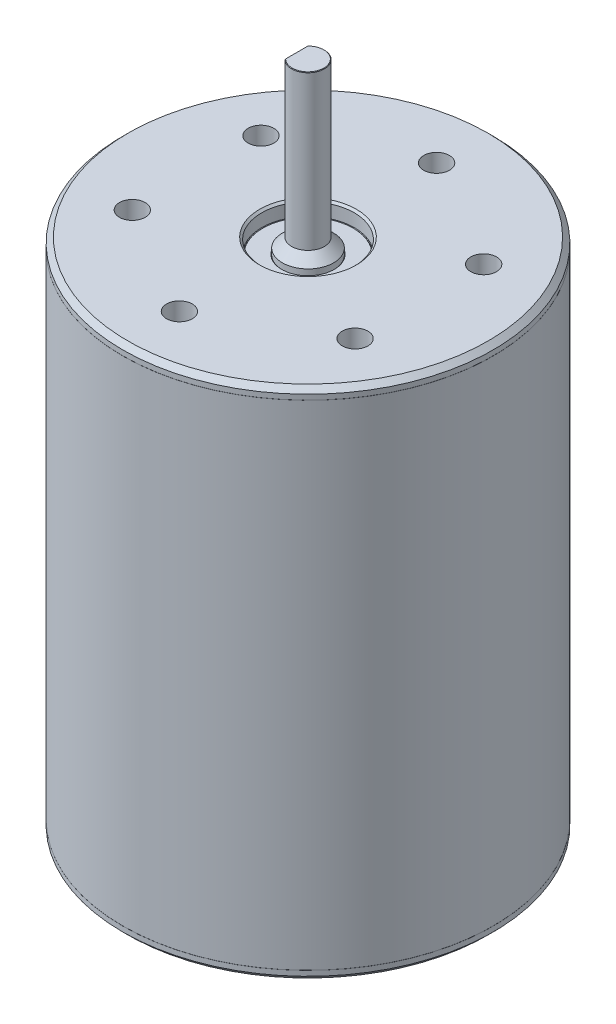
ISO-10303-21;
HEADER;
FILE_DESCRIPTION(('STEP AP214'),'2;1');
FILE_NAME('part.step','',(''),(''),'','','');
FILE_SCHEMA(('AUTOMOTIVE_DESIGN { 1 0 10303 214 1 1 1 1 }'));
ENDSEC;
DATA;
#1=APPLICATION_CONTEXT('core data for automotive mechanical design processes');
#2=APPLICATION_PROTOCOL_DEFINITION('international standard','automotive_design',2000,#1);
#3=PRODUCT_CONTEXT('',#1,'mechanical');
#4=PRODUCT('Part','Part','',(#3));
#5=PRODUCT_RELATED_PRODUCT_CATEGORY('part','',(#4));
#6=PRODUCT_DEFINITION_FORMATION('','',#4);
#7=PRODUCT_DEFINITION_CONTEXT('part definition',#1,'design');
#8=PRODUCT_DEFINITION('design','',#6,#7);
#9=PRODUCT_DEFINITION_SHAPE('','',#8);
#10=(LENGTH_UNIT() NAMED_UNIT(*) SI_UNIT(.MILLI.,.METRE.));
#11=(NAMED_UNIT(*) PLANE_ANGLE_UNIT() SI_UNIT($,.RADIAN.));
#12=(NAMED_UNIT(*) SI_UNIT($,.STERADIAN.) SOLID_ANGLE_UNIT());
#13=UNCERTAINTY_MEASURE_WITH_UNIT(LENGTH_MEASURE(1.E-05),#10,'distance_accuracy_value','');
#14=(GEOMETRIC_REPRESENTATION_CONTEXT(3) GLOBAL_UNCERTAINTY_ASSIGNED_CONTEXT((#13)) GLOBAL_UNIT_ASSIGNED_CONTEXT((#10,
#11,#12)) REPRESENTATION_CONTEXT('',''));
#15=CARTESIAN_POINT('',(0.,0.,0.));
#16=DIRECTION('',(0.,0.,1.));
#17=DIRECTION('',(1.,0.,0.));
#18=AXIS2_PLACEMENT_3D('',#15,#16,#17);
#19=CARTESIAN_POINT('',(0.,65.,0.));
#20=DIRECTION('',(0.,-1.,0.));
#21=DIRECTION('',(0.,0.,-1.));
#22=AXIS2_PLACEMENT_3D('',#19,#20,#21);
#23=PLANE('',#22);
#24=CARTESIAN_POINT('',(0.,65.,0.));
#25=DIRECTION('',(0.,-1.,0.));
#26=DIRECTION('',(0.,0.,-1.));
#27=AXIS2_PLACEMENT_3D('',#24,#25,#26);
#28=CIRCLE('',#27,1.53750000000045);
#29=CARTESIAN_POINT('',(-1.08750000000003,65.,-1.08685325596481));
#30=VERTEX_POINT('',#29);
#31=CARTESIAN_POINT('',(-1.08750000000003,65.,1.08685325596481));
#32=VERTEX_POINT('',#31);
#33=EDGE_CURVE('E46',#30,#32,#28,.T.);
#34=ORIENTED_EDGE('',*,*,#33,.F.);
#35=DIRECTION('',(0.,0.,-1.));
#36=VECTOR('',#35,1.);
#37=CARTESIAN_POINT('',(-1.08750000000003,65.,1.15650335062205));
#38=LINE('',#37,#36);
#39=EDGE_CURVE('E58',#32,#30,#38,.T.);
#40=ORIENTED_EDGE('',*,*,#39,.F.);
#41=EDGE_LOOP('',(#34,#40));
#42=FACE_BOUND('',#41,.T.);
#43=ADVANCED_FACE('F39',(#42),#23,.F.);
#44=CARTESIAN_POINT('',(0.,65.,0.));
#45=DIRECTION('',(0.,-1.,0.));
#46=DIRECTION('',(0.,0.,-1.));
#47=AXIS2_PLACEMENT_3D('',#44,#45,#46);
#48=CONICAL_SURFACE('',#47,1.53750000000045,0.785398163393177);
#49=CARTESIAN_POINT('',(0.,64.95,0.));
#50=DIRECTION('',(0.,-1.,0.));
#51=DIRECTION('',(0.,0.,-1.));
#52=AXIS2_PLACEMENT_3D('',#49,#50,#51);
#53=CIRCLE('',#52,1.58750000000003);
#54=CARTESIAN_POINT('',(-1.08750000000004,64.95,-1.15650335062204));
#55=VERTEX_POINT('',#54);
#56=CARTESIAN_POINT('',(-1.08750000000003,64.95,1.15650335062205));
#57=VERTEX_POINT('',#56);
#58=EDGE_CURVE('E286',#55,#57,#53,.T.);
#59=ORIENTED_EDGE('',*,*,#58,.F.);
#60=CARTESIAN_POINT('',(-1.08750000000003,63.7700419506171,-2.54483158677317));
#61=CARTESIAN_POINT('',(-1.08750000000003,63.8393574132334,-2.46942990502367));
#62=CARTESIAN_POINT('',(-1.08750000000003,63.9084378895368,-2.39380884295104));
#63=CARTESIAN_POINT('',(-1.08750000000003,64.0459393933325,-2.24193835008321));
#64=CARTESIAN_POINT('',(-1.08750000000003,64.1143602651496,-2.16568877846522));
#65=CARTESIAN_POINT('',(-1.08750000000003,64.2507432688793,-2.01193012483827));
#66=CARTESIAN_POINT('',(-1.08750000000003,64.3186999101287,-1.93441616097864));
#67=CARTESIAN_POINT('',(-1.08750000000003,64.4533777532537,-1.77833425306525));
#68=CARTESIAN_POINT('',(-1.08750000000003,64.5200991032538,-1.6997664373534));
#69=CARTESIAN_POINT('',(-1.08750000000003,64.6398864452629,-1.55550283847927));
#70=CARTESIAN_POINT('',(-1.08750000000003,64.6932408383618,-1.49004726171976));
#71=CARTESIAN_POINT('',(-1.08750000000003,64.7983139627554,-1.35783870766236));
#72=CARTESIAN_POINT('',(-1.08750000000003,64.8500328431013,-1.29108584949162));
#73=CARTESIAN_POINT('',(-1.08750000000003,64.9510862906292,-1.155885935855));
#74=CARTESIAN_POINT('',(-1.08750000000003,65.0004231128141,-1.08744057928912));
#75=CARTESIAN_POINT('',(-1.08750000000003,65.0955912460557,-0.94817491536375));
#76=CARTESIAN_POINT('',(-1.08750000000003,65.1414244654358,-0.877355931536199));
#77=CARTESIAN_POINT('',(-1.08750000000003,65.2272459068599,-0.733108340500361));
#78=CARTESIAN_POINT('',(-1.08750000000003,65.2672856976976,-0.659711057615247));
#79=CARTESIAN_POINT('',(-1.08750000000003,65.3387166674856,-0.508759883202247));
#80=CARTESIAN_POINT('',(-1.08750000000003,65.3701206806991,-0.431212366810844));
#81=CARTESIAN_POINT('',(-1.08750000000003,65.4139523729496,-0.288513110161178));
#82=CARTESIAN_POINT('',(-1.08750000000003,65.4289884548958,-0.22420739300879));
#83=CARTESIAN_POINT('',(-1.08750000000003,65.4431283139796,-0.126634464617955));
#84=CARTESIAN_POINT('',(-1.08750000000003,65.4464401750485,-0.0939604963872236));
#85=CARTESIAN_POINT('',(-1.08750000000003,65.4501183489409,-0.0284415651914882));
#86=CARTESIAN_POINT('',(-1.08750000000003,65.4504847585882,0.00440339211718887));
#87=CARTESIAN_POINT('',(-1.08750000000003,65.4482426692732,0.0700097078457308));
#88=CARTESIAN_POINT('',(-1.08750000000003,65.4456323622563,0.102771003330139));
#89=CARTESIAN_POINT('',(-1.08750000000003,65.4375840958874,0.167950433977804));
#90=CARTESIAN_POINT('',(-1.08750000000003,65.4321448978177,0.200368412458755));
#91=CARTESIAN_POINT('',(-1.08750000000003,65.4119405444451,0.296965792484501));
#92=CARTESIAN_POINT('',(-1.08750000000003,65.3932955971157,0.360341834713261));
#93=CARTESIAN_POINT('',(-1.08750000000003,65.3440892506831,0.49637397673723));
#94=CARTESIAN_POINT('',(-1.08750000000003,65.3119085736807,0.568414591899574));
#95=CARTESIAN_POINT('',(-1.08750000000003,65.2406658354068,0.709085250929294));
#96=CARTESIAN_POINT('',(-1.08750000000003,65.2015885758673,0.777707323875136));
#97=CARTESIAN_POINT('',(-1.08750000000003,65.1185954478633,0.912968960404902));
#98=CARTESIAN_POINT('',(-1.08750000000003,65.0746303971166,0.979577808019166));
#99=CARTESIAN_POINT('',(-1.08750000000003,64.9837312233639,1.11075281613543));
#100=CARTESIAN_POINT('',(-1.08750000000003,64.9367958993025,1.17531813428315));
#101=CARTESIAN_POINT('',(-1.08750000000003,64.8447841988002,1.29773706963906));
#102=CARTESIAN_POINT('',(-1.08750000000003,64.7998658156197,1.35571031317382));
#103=CARTESIAN_POINT('',(-1.08750000000003,64.7087657555329,1.47065816423442));
#104=CARTESIAN_POINT('',(-1.08750000000003,64.662583990779,1.52763270186227));
#105=CARTESIAN_POINT('',(-1.08750000000003,64.5225748803759,1.69747261607305));
#106=CARTESIAN_POINT('',(-1.08750000000003,64.42734290602,1.80917745492842));
#107=CARTESIAN_POINT('',(-1.08750000000003,64.2390478794264,2.02556114053063));
#108=CARTESIAN_POINT('',(-1.08750000000003,64.1460846761797,2.13032774281245));
#109=CARTESIAN_POINT('',(-1.08750000000003,64.0056759709561,2.28647989755538));
#110=CARTESIAN_POINT('',(-1.08750000000003,63.9587449733074,2.33832906487026));
#111=CARTESIAN_POINT('',(-1.08750000000003,63.8645955750018,2.4417652853061));
#112=CARTESIAN_POINT('',(-1.08750000000003,63.8173771761829,2.49335234009954));
#113=CARTESIAN_POINT('',(-1.08750000000003,63.7700419506171,2.54483158677317));
#114=B_SPLINE_CURVE_WITH_KNOTS('',3,(#60,#61,#62,#63,#64,#65,#66,#67,#68,#69,#70,#71,#72,#73,
#74,#75,#76,#77,#78,#79,#80,#81,#82,#83,#84,#85,#86,#87,#88,#89,#90,#91,#92,#93,#94,#95,#96,#97,
#98,#99,#100,#101,#102,#103,#104,#105,#106,#107,#108,#109,#110,#111,#112,#113),.UNSPECIFIED.,
.F.,.F.,(4,2,2,2,2,2,2,2,2,2,2,2,2,2,2,2,2,2,2,2,2,2,2,2,2,2,4),(0.,0.307266051857471,
0.614602929348941,0.923849143600157,1.23305803262821,1.48637798136466,1.73967477706011,
1.99272688602582,2.24564016704245,2.49614173027639,2.74626896759265,2.9435083331397,
3.04191462494382,3.14031768189,3.2387805405986,3.33728655067103,3.53473391165814,
3.77087742669045,4.00754799081056,4.24686280058207,4.48627500542515,4.7062687823178,
4.92627789527169,5.36658692217465,5.78676859211025,5.99657151111412,6.20637308973177),.UNSPECIFIED.);
#115=EDGE_CURVE('E53',#55,#30,#114,.T.);
#116=ORIENTED_EDGE('',*,*,#115,.T.);
#117=ORIENTED_EDGE('',*,*,#33,.T.);
#118=EDGE_CURVE('E140',#32,#57,#114,.T.);
#119=ORIENTED_EDGE('',*,*,#118,.T.);
#120=EDGE_LOOP('',(#59,#116,#117,#119));
#121=FACE_BOUND('',#120,.T.);
#122=ADVANCED_FACE('F150',(#121),#48,.T.);
#123=CARTESIAN_POINT('',(0.,-4.92112905965301,0.));
#124=DIRECTION('',(0.,-1.,0.));
#125=DIRECTION('',(0.,0.,-1.));
#126=AXIS2_PLACEMENT_3D('',#123,#124,#125);
#127=CYLINDRICAL_SURFACE('',#126,1.58750000000001);
#128=CARTESIAN_POINT('',(0.,50.,0.));
#129=DIRECTION('',(0.,-1.,0.));
#130=DIRECTION('',(0.,0.,-1.));
#131=AXIS2_PLACEMENT_3D('',#128,#129,#130);
#132=CIRCLE('',#131,1.58749999999999);
#133=CARTESIAN_POINT('',(0.,50.,-1.58749999999999));
#134=VERTEX_POINT('',#133);
#135=EDGE_CURVE('E288',#134,#134,#132,.T.);
#136=ORIENTED_EDGE('',*,*,#135,.F.);
#137=EDGE_LOOP('',(#136));
#138=FACE_BOUND('',#137,.T.);
#139=ORIENTED_EDGE('',*,*,#58,.T.);
#140=DIRECTION('',(0.,1.,0.));
#141=VECTOR('',#140,1.);
#142=CARTESIAN_POINT('',(-1.08750000000003,47.6335680867601,1.15650335062205));
#143=LINE('',#142,#141);
#144=CARTESIAN_POINT('',(-1.08750000000003,53.,1.15650335062205));
#145=VERTEX_POINT('',#144);
#146=EDGE_CURVE('E134',#145,#57,#143,.T.);
#147=ORIENTED_EDGE('',*,*,#146,.F.);
#148=CARTESIAN_POINT('',(0.,53.,0.));
#149=DIRECTION('',(0.,-1.,0.));
#150=DIRECTION('',(0.,0.,-1.));
#151=AXIS2_PLACEMENT_3D('',#148,#149,#150);
#152=CIRCLE('',#151,1.58750000000001);
#153=CARTESIAN_POINT('',(-1.08750000000003,53.,-1.15650335062205));
#154=VERTEX_POINT('',#153);
#155=EDGE_CURVE('E13',#145,#154,#152,.T.);
#156=ORIENTED_EDGE('',*,*,#155,.T.);
#157=DIRECTION('',(0.,1.,0.));
#158=VECTOR('',#157,1.);
#159=CARTESIAN_POINT('',(-1.08750000000003,47.6335680867601,-1.15650335062205));
#160=LINE('',#159,#158);
#161=EDGE_CURVE('E137',#154,#55,#160,.T.);
#162=ORIENTED_EDGE('',*,*,#161,.T.);
#163=EDGE_LOOP('',(#139,#147,#156,#162));
#164=FACE_BOUND('',#163,.T.);
#165=ADVANCED_FACE('F270',(#138,#164),#127,.T.);
#166=CARTESIAN_POINT('',(0.,50.,0.));
#167=DIRECTION('',(0.,-1.,0.));
#168=DIRECTION('',(0.,0.,-1.));
#169=AXIS2_PLACEMENT_3D('',#166,#167,#168);
#170=CONICAL_SURFACE('',#169,1.58749999999999,0.785398163397445);
#171=CARTESIAN_POINT('',(0.,49.0875,0.));
#172=DIRECTION('',(0.,-1.,0.));
#173=DIRECTION('',(0.,0.,-1.));
#174=AXIS2_PLACEMENT_3D('',#171,#172,#173);
#175=CIRCLE('',#174,2.49999999999999);
#176=CARTESIAN_POINT('',(0.,49.0875,-2.49999999999999));
#177=VERTEX_POINT('',#176);
#178=EDGE_CURVE('E293',#177,#177,#175,.T.);
#179=ORIENTED_EDGE('',*,*,#178,.F.);
#180=EDGE_LOOP('',(#179));
#181=FACE_BOUND('',#180,.T.);
#182=ORIENTED_EDGE('',*,*,#135,.T.);
#183=EDGE_LOOP('',(#182));
#184=FACE_BOUND('',#183,.T.);
#185=ADVANCED_FACE('F267',(#181,#184),#170,.T.);
#186=CARTESIAN_POINT('',(0.,-4.92112905965301,0.));
#187=DIRECTION('',(0.,-1.,0.));
#188=DIRECTION('',(0.,0.,-1.));
#189=AXIS2_PLACEMENT_3D('',#186,#187,#188);
#190=CYLINDRICAL_SURFACE('',#189,2.49999999999999);
#191=CARTESIAN_POINT('',(0.,48.5,0.));
#192=DIRECTION('',(0.,-1.,0.));
#193=DIRECTION('',(0.,0.,-1.));
#194=AXIS2_PLACEMENT_3D('',#191,#192,#193);
#195=CIRCLE('',#194,2.49999999999999);
#196=CARTESIAN_POINT('',(0.,48.5,-2.49999999999999));
#197=VERTEX_POINT('',#196);
#198=EDGE_CURVE('E296',#197,#197,#195,.T.);
#199=ORIENTED_EDGE('',*,*,#198,.F.);
#200=EDGE_LOOP('',(#199));
#201=FACE_BOUND('',#200,.T.);
#202=ORIENTED_EDGE('',*,*,#178,.T.);
#203=EDGE_LOOP('',(#202));
#204=FACE_BOUND('',#203,.T.);
#205=ADVANCED_FACE('F263',(#201,#204),#190,.T.);
#206=CARTESIAN_POINT('',(0.,48.5,0.));
#207=DIRECTION('',(0.,1.,0.));
#208=DIRECTION('',(0.,0.,1.));
#209=AXIS2_PLACEMENT_3D('',#206,#207,#208);
#210=CONICAL_SURFACE('',#209,2.49999999999999,0.785398163397461);
#211=CARTESIAN_POINT('',(0.,48.55,0.));
#212=DIRECTION('',(0.,-1.,0.));
#213=DIRECTION('',(0.,0.,-1.));
#214=AXIS2_PLACEMENT_3D('',#211,#212,#213);
#215=CIRCLE('',#214,2.54999999999999);
#216=CARTESIAN_POINT('',(0.,48.55,-2.54999999999999));
#217=VERTEX_POINT('',#216);
#218=EDGE_CURVE('E299',#217,#217,#215,.T.);
#219=ORIENTED_EDGE('',*,*,#218,.F.);
#220=EDGE_LOOP('',(#219));
#221=FACE_BOUND('',#220,.T.);
#222=ORIENTED_EDGE('',*,*,#198,.T.);
#223=EDGE_LOOP('',(#222));
#224=FACE_BOUND('',#223,.T.);
#225=ADVANCED_FACE('F259',(#221,#224),#210,.F.);
#226=CARTESIAN_POINT('',(-2.54999999999999,48.55,0.));
#227=DIRECTION('',(0.,-1.,0.));
#228=DIRECTION('',(0.,0.,-1.));
#229=AXIS2_PLACEMENT_3D('',#226,#227,#228);
#230=PLANE('',#229);
#231=CARTESIAN_POINT('',(0.,48.55,0.));
#232=DIRECTION('',(0.,-1.,0.));
#233=DIRECTION('',(0.,0.,-1.));
#234=AXIS2_PLACEMENT_3D('',#231,#232,#233);
#235=CIRCLE('',#234,4.39999999999999);
#236=CARTESIAN_POINT('',(0.,48.55,-4.39999999999999));
#237=VERTEX_POINT('',#236);
#238=EDGE_CURVE('E302',#237,#237,#235,.T.);
#239=ORIENTED_EDGE('',*,*,#238,.F.);
#240=EDGE_LOOP('',(#239));
#241=FACE_BOUND('',#240,.T.);
#242=ORIENTED_EDGE('',*,*,#218,.T.);
#243=EDGE_LOOP('',(#242));
#244=FACE_BOUND('',#243,.T.);
#245=ADVANCED_FACE('F255',(#241,#244),#230,.F.);
#246=CARTESIAN_POINT('',(0.,48.55,0.));
#247=DIRECTION('',(0.,-1.,0.));
#248=DIRECTION('',(0.,0.,-1.));
#249=AXIS2_PLACEMENT_3D('',#246,#247,#248);
#250=CONICAL_SURFACE('',#249,4.39999999999999,0.785398163397474);
#251=CARTESIAN_POINT('',(0.,48.5,0.));
#252=DIRECTION('',(0.,-1.,0.));
#253=DIRECTION('',(0.,0.,-1.));
#254=AXIS2_PLACEMENT_3D('',#251,#252,#253);
#255=CIRCLE('',#254,4.45);
#256=CARTESIAN_POINT('',(0.,48.5,-4.45));
#257=VERTEX_POINT('',#256);
#258=EDGE_CURVE('E305',#257,#257,#255,.T.);
#259=ORIENTED_EDGE('',*,*,#258,.F.);
#260=EDGE_LOOP('',(#259));
#261=FACE_BOUND('',#260,.T.);
#262=ORIENTED_EDGE('',*,*,#238,.T.);
#263=EDGE_LOOP('',(#262));
#264=FACE_BOUND('',#263,.T.);
#265=ADVANCED_FACE('F251',(#261,#264),#250,.T.);
#266=CARTESIAN_POINT('',(0.,48.5,0.));
#267=DIRECTION('',(0.,1.,0.));
#268=DIRECTION('',(0.,0.,1.));
#269=AXIS2_PLACEMENT_3D('',#266,#267,#268);
#270=CONICAL_SURFACE('',#269,4.45,0.785398163397396);
#271=CARTESIAN_POINT('',(0.,48.55,0.));
#272=DIRECTION('',(0.,-1.,0.));
#273=DIRECTION('',(0.,0.,-1.));
#274=AXIS2_PLACEMENT_3D('',#271,#272,#273);
#275=CIRCLE('',#274,4.49999999999999);
#276=CARTESIAN_POINT('',(0.,48.55,-4.49999999999999));
#277=VERTEX_POINT('',#276);
#278=EDGE_CURVE('E308',#277,#277,#275,.T.);
#279=ORIENTED_EDGE('',*,*,#278,.F.);
#280=EDGE_LOOP('',(#279));
#281=FACE_BOUND('',#280,.T.);
#282=ORIENTED_EDGE('',*,*,#258,.T.);
#283=EDGE_LOOP('',(#282));
#284=FACE_BOUND('',#283,.T.);
#285=ADVANCED_FACE('F247',(#281,#284),#270,.F.);
#286=CARTESIAN_POINT('',(0.,-4.92112905965301,0.));
#287=DIRECTION('',(0.,-1.,0.));
#288=DIRECTION('',(0.,0.,-1.));
#289=AXIS2_PLACEMENT_3D('',#286,#287,#288);
#290=CYLINDRICAL_SURFACE('',#289,4.49999999999999);
#291=CARTESIAN_POINT('',(0.,49.8,0.));
#292=DIRECTION('',(0.,-1.,0.));
#293=DIRECTION('',(0.,0.,-1.));
#294=AXIS2_PLACEMENT_3D('',#291,#292,#293);
#295=CIRCLE('',#294,4.5);
#296=CARTESIAN_POINT('',(0.,49.8,-4.5));
#297=VERTEX_POINT('',#296);
#298=EDGE_CURVE('E311',#297,#297,#295,.T.);
#299=ORIENTED_EDGE('',*,*,#298,.F.);
#300=EDGE_LOOP('',(#299));
#301=FACE_BOUND('',#300,.T.);
#302=ORIENTED_EDGE('',*,*,#278,.T.);
#303=EDGE_LOOP('',(#302));
#304=FACE_BOUND('',#303,.T.);
#305=ADVANCED_FACE('F243',(#301,#304),#290,.F.);
#306=CARTESIAN_POINT('',(0.,49.8,0.));
#307=DIRECTION('',(0.,1.,0.));
#308=DIRECTION('',(0.,0.,1.));
#309=AXIS2_PLACEMENT_3D('',#306,#307,#308);
#310=CONICAL_SURFACE('',#309,4.5,0.785398163397466);
#311=CARTESIAN_POINT('',(0.,50.,0.));
#312=DIRECTION('',(0.,-1.,0.));
#313=DIRECTION('',(0.,0.,-1.));
#314=AXIS2_PLACEMENT_3D('',#311,#312,#313);
#315=CIRCLE('',#314,4.7);
#316=CARTESIAN_POINT('',(0.,50.,-4.7));
#317=VERTEX_POINT('',#316);
#318=EDGE_CURVE('E314',#317,#317,#315,.T.);
#319=ORIENTED_EDGE('',*,*,#318,.F.);
#320=EDGE_LOOP('',(#319));
#321=FACE_BOUND('',#320,.T.);
#322=ORIENTED_EDGE('',*,*,#298,.T.);
#323=EDGE_LOOP('',(#322));
#324=FACE_BOUND('',#323,.T.);
#325=ADVANCED_FACE('F239',(#321,#324),#310,.F.);
#326=CARTESIAN_POINT('',(-4.7,50.,0.));
#327=DIRECTION('',(0.,-1.,0.));
#328=DIRECTION('',(0.,0.,-1.));
#329=AXIS2_PLACEMENT_3D('',#326,#327,#328);
#330=PLANE('',#329);
#331=CARTESIAN_POINT('',(10.8253175473054,50.,-6.25000000000013));
#332=DIRECTION('',(0.,1.,0.));
#333=DIRECTION('',(0.,0.,1.));
#334=AXIS2_PLACEMENT_3D('',#331,#332,#333);
#335=CIRCLE('',#334,1.25);
#336=CARTESIAN_POINT('',(10.8253175473054,50.,-5.00000000000013));
#337=VERTEX_POINT('',#336);
#338=EDGE_CURVE('E99',#337,#337,#335,.T.);
#339=ORIENTED_EDGE('',*,*,#338,.F.);
#340=EDGE_LOOP('',(#339));
#341=FACE_BOUND('',#340,.T.);
#342=CARTESIAN_POINT('',(10.8253175473055,50.,6.2499999999999));
#343=DIRECTION('',(0.,1.,0.));
#344=DIRECTION('',(0.,0.,1.));
#345=AXIS2_PLACEMENT_3D('',#342,#343,#344);
#346=CIRCLE('',#345,1.25);
#347=CARTESIAN_POINT('',(10.8253175473055,50.,7.4999999999999));
#348=VERTEX_POINT('',#347);
#349=EDGE_CURVE('E98',#348,#348,#346,.T.);
#350=ORIENTED_EDGE('',*,*,#349,.F.);
#351=EDGE_LOOP('',(#350));
#352=FACE_BOUND('',#351,.T.);
#353=CARTESIAN_POINT('',(0.,50.,12.5));
#354=DIRECTION('',(0.,1.,0.));
#355=DIRECTION('',(0.,0.,1.));
#356=AXIS2_PLACEMENT_3D('',#353,#354,#355);
#357=CIRCLE('',#356,1.25);
#358=CARTESIAN_POINT('',(0.,50.,13.75));
#359=VERTEX_POINT('',#358);
#360=EDGE_CURVE('E109',#359,#359,#357,.T.);
#361=ORIENTED_EDGE('',*,*,#360,.F.);
#362=EDGE_LOOP('',(#361));
#363=FACE_BOUND('',#362,.T.);
#364=CARTESIAN_POINT('',(-10.8253175473055,50.,6.25000000000005));
#365=DIRECTION('',(0.,1.,0.));
#366=DIRECTION('',(0.,0.,1.));
#367=AXIS2_PLACEMENT_3D('',#364,#365,#366);
#368=CIRCLE('',#367,1.25);
#369=CARTESIAN_POINT('',(-10.8253175473055,50.,7.50000000000005));
#370=VERTEX_POINT('',#369);
#371=EDGE_CURVE('E115',#370,#370,#368,.T.);
#372=ORIENTED_EDGE('',*,*,#371,.F.);
#373=EDGE_LOOP('',(#372));
#374=FACE_BOUND('',#373,.T.);
#375=CARTESIAN_POINT('',(-10.8253175473055,50.,-6.24999999999998));
#376=DIRECTION('',(0.,1.,0.));
#377=DIRECTION('',(0.,0.,1.));
#378=AXIS2_PLACEMENT_3D('',#375,#376,#377);
#379=CIRCLE('',#378,1.25);
#380=CARTESIAN_POINT('',(-10.8253175473055,50.,-4.99999999999998));
#381=VERTEX_POINT('',#380);
#382=EDGE_CURVE('E121',#381,#381,#379,.T.);
#383=ORIENTED_EDGE('',*,*,#382,.F.);
#384=EDGE_LOOP('',(#383));
#385=FACE_BOUND('',#384,.T.);
#386=CARTESIAN_POINT('',(0.,50.,-12.5));
#387=DIRECTION('',(0.,1.,0.));
#388=DIRECTION('',(0.,0.,1.));
#389=AXIS2_PLACEMENT_3D('',#386,#387,#388);
#390=CIRCLE('',#389,1.25);
#391=CARTESIAN_POINT('',(0.,50.,-11.25));
#392=VERTEX_POINT('',#391);
#393=EDGE_CURVE('E127',#392,#392,#390,.T.);
#394=ORIENTED_EDGE('',*,*,#393,.F.);
#395=EDGE_LOOP('',(#394));
#396=FACE_BOUND('',#395,.T.);
#397=CARTESIAN_POINT('',(0.,50.,0.));
#398=DIRECTION('',(0.,-1.,0.));
#399=DIRECTION('',(0.,0.,-1.));
#400=AXIS2_PLACEMENT_3D('',#397,#398,#399);
#401=CIRCLE('',#400,17.5);
#402=CARTESIAN_POINT('',(0.,50.,-17.5));
#403=VERTEX_POINT('',#402);
#404=EDGE_CURVE('E317',#403,#403,#401,.T.);
#405=ORIENTED_EDGE('',*,*,#404,.F.);
#406=EDGE_LOOP('',(#405));
#407=FACE_BOUND('',#406,.T.);
#408=ORIENTED_EDGE('',*,*,#318,.T.);
#409=EDGE_LOOP('',(#408));
#410=FACE_BOUND('',#409,.T.);
#411=ADVANCED_FACE('F235',(#341,#352,#363,#374,#385,#396,#407,#410),#330,.F.);
#412=CARTESIAN_POINT('',(0.,50.,0.));
#413=DIRECTION('',(0.,-1.,0.));
#414=DIRECTION('',(0.,0.,-1.));
#415=AXIS2_PLACEMENT_3D('',#412,#413,#414);
#416=CONICAL_SURFACE('',#415,17.5,0.785398163397445);
#417=CARTESIAN_POINT('',(0.,49.5,0.));
#418=DIRECTION('',(0.,-1.,0.));
#419=DIRECTION('',(0.,0.,-1.));
#420=AXIS2_PLACEMENT_3D('',#417,#418,#419);
#421=CIRCLE('',#420,18.);
#422=CARTESIAN_POINT('',(0.,49.5,-18.));
#423=VERTEX_POINT('',#422);
#424=EDGE_CURVE('E320',#423,#423,#421,.T.);
#425=ORIENTED_EDGE('',*,*,#424,.F.);
#426=EDGE_LOOP('',(#425));
#427=FACE_BOUND('',#426,.T.);
#428=ORIENTED_EDGE('',*,*,#404,.T.);
#429=EDGE_LOOP('',(#428));
#430=FACE_BOUND('',#429,.T.);
#431=ADVANCED_FACE('F231',(#427,#430),#416,.T.);
#432=CARTESIAN_POINT('',(0.,-4.92112905965301,0.));
#433=DIRECTION('',(0.,-1.,0.));
#434=DIRECTION('',(0.,0.,-1.));
#435=AXIS2_PLACEMENT_3D('',#432,#433,#434);
#436=CYLINDRICAL_SURFACE('',#435,18.);
#437=CARTESIAN_POINT('',(0.,49.,0.));
#438=DIRECTION('',(0.,-1.,0.));
#439=DIRECTION('',(0.,0.,-1.));
#440=AXIS2_PLACEMENT_3D('',#437,#438,#439);
#441=CIRCLE('',#440,18.);
#442=CARTESIAN_POINT('',(0.,49.,-18.));
#443=VERTEX_POINT('',#442);
#444=EDGE_CURVE('E323',#443,#443,#441,.T.);
#445=ORIENTED_EDGE('',*,*,#444,.F.);
#446=EDGE_LOOP('',(#445));
#447=FACE_BOUND('',#446,.T.);
#448=ORIENTED_EDGE('',*,*,#424,.T.);
#449=EDGE_LOOP('',(#448));
#450=FACE_BOUND('',#449,.T.);
#451=ADVANCED_FACE('F227',(#447,#450),#436,.T.);
#452=CARTESIAN_POINT('',(0.,49.,0.));
#453=DIRECTION('',(0.,1.,0.));
#454=DIRECTION('',(0.,0.,1.));
#455=AXIS2_PLACEMENT_3D('',#452,#453,#454);
#456=CONICAL_SURFACE('',#455,18.,0.785398163397101);
#457=CARTESIAN_POINT('',(0.,48.995,0.));
#458=DIRECTION('',(0.,-1.,0.));
#459=DIRECTION('',(0.,0.,-1.));
#460=AXIS2_PLACEMENT_3D('',#457,#458,#459);
#461=CIRCLE('',#460,17.995);
#462=CARTESIAN_POINT('',(0.,48.995,-17.995));
#463=VERTEX_POINT('',#462);
#464=EDGE_CURVE('E326',#463,#463,#461,.T.);
#465=ORIENTED_EDGE('',*,*,#464,.F.);
#466=EDGE_LOOP('',(#465));
#467=FACE_BOUND('',#466,.T.);
#468=ORIENTED_EDGE('',*,*,#444,.T.);
#469=EDGE_LOOP('',(#468));
#470=FACE_BOUND('',#469,.T.);
#471=ADVANCED_FACE('F223',(#467,#470),#456,.T.);
#472=CARTESIAN_POINT('',(0.,48.995,0.));
#473=DIRECTION('',(0.,-1.,0.));
#474=DIRECTION('',(0.,0.,-1.));
#475=AXIS2_PLACEMENT_3D('',#472,#473,#474);
#476=CONICAL_SURFACE('',#475,17.995,0.785398163397101);
#477=CARTESIAN_POINT('',(0.,48.99,0.));
#478=DIRECTION('',(0.,-1.,0.));
#479=DIRECTION('',(0.,0.,-1.));
#480=AXIS2_PLACEMENT_3D('',#477,#478,#479);
#481=CIRCLE('',#480,18.);
#482=CARTESIAN_POINT('',(0.,48.99,-18.));
#483=VERTEX_POINT('',#482);
#484=EDGE_CURVE('E329',#483,#483,#481,.T.);
#485=ORIENTED_EDGE('',*,*,#484,.F.);
#486=EDGE_LOOP('',(#485));
#487=FACE_BOUND('',#486,.T.);
#488=ORIENTED_EDGE('',*,*,#464,.T.);
#489=EDGE_LOOP('',(#488));
#490=FACE_BOUND('',#489,.T.);
#491=ADVANCED_FACE('F219',(#487,#490),#476,.T.);
#492=CARTESIAN_POINT('',(0.,-4.92112905965301,0.));
#493=DIRECTION('',(0.,-1.,0.));
#494=DIRECTION('',(0.,0.,-1.));
#495=AXIS2_PLACEMENT_3D('',#492,#493,#494);
#496=CYLINDRICAL_SURFACE('',#495,17.9999999999999);
#497=CARTESIAN_POINT('',(0.,1.00999999999997,0.));
#498=DIRECTION('',(0.,-1.,0.));
#499=DIRECTION('',(0.,0.,-1.));
#500=AXIS2_PLACEMENT_3D('',#497,#498,#499);
#501=CIRCLE('',#500,17.9999999999999);
#502=CARTESIAN_POINT('',(0.,1.00999999999997,-17.9999999999999));
#503=VERTEX_POINT('',#502);
#504=EDGE_CURVE('E332',#503,#503,#501,.T.);
#505=ORIENTED_EDGE('',*,*,#504,.F.);
#506=EDGE_LOOP('',(#505));
#507=FACE_BOUND('',#506,.T.);
#508=ORIENTED_EDGE('',*,*,#484,.T.);
#509=EDGE_LOOP('',(#508));
#510=FACE_BOUND('',#509,.T.);
#511=ADVANCED_FACE('F215',(#507,#510),#496,.T.);
#512=CARTESIAN_POINT('',(0.,1.00999999999997,0.));
#513=DIRECTION('',(0.,1.,0.));
#514=DIRECTION('',(0.,0.,1.));
#515=AXIS2_PLACEMENT_3D('',#512,#513,#514);
#516=CONICAL_SURFACE('',#515,17.9999999999999,0.785398163397709);
#517=CARTESIAN_POINT('',(0.,1.00499999999998,0.));
#518=DIRECTION('',(0.,-1.,0.));
#519=DIRECTION('',(0.,0.,-1.));
#520=AXIS2_PLACEMENT_3D('',#517,#518,#519);
#521=CIRCLE('',#520,17.9949999999999);
#522=CARTESIAN_POINT('',(0.,1.00499999999998,-17.9949999999999));
#523=VERTEX_POINT('',#522);
#524=EDGE_CURVE('E335',#523,#523,#521,.T.);
#525=ORIENTED_EDGE('',*,*,#524,.F.);
#526=EDGE_LOOP('',(#525));
#527=FACE_BOUND('',#526,.T.);
#528=ORIENTED_EDGE('',*,*,#504,.T.);
#529=EDGE_LOOP('',(#528));
#530=FACE_BOUND('',#529,.T.);
#531=ADVANCED_FACE('F211',(#527,#530),#516,.T.);
#532=CARTESIAN_POINT('',(0.,1.00499999999998,0.));
#533=DIRECTION('',(0.,-1.,0.));
#534=DIRECTION('',(0.,0.,-1.));
#535=AXIS2_PLACEMENT_3D('',#532,#533,#534);
#536=CONICAL_SURFACE('',#535,17.9949999999999,0.785398163397882);
#537=CARTESIAN_POINT('',(0.,0.999999999999984,0.));
#538=DIRECTION('',(0.,-1.,0.));
#539=DIRECTION('',(0.,0.,-1.));
#540=AXIS2_PLACEMENT_3D('',#537,#538,#539);
#541=CIRCLE('',#540,17.9999999999999);
#542=CARTESIAN_POINT('',(0.,0.999999999999984,-17.9999999999999));
#543=VERTEX_POINT('',#542);
#544=EDGE_CURVE('E338',#543,#543,#541,.T.);
#545=ORIENTED_EDGE('',*,*,#544,.F.);
#546=EDGE_LOOP('',(#545));
#547=FACE_BOUND('',#546,.T.);
#548=ORIENTED_EDGE('',*,*,#524,.T.);
#549=EDGE_LOOP('',(#548));
#550=FACE_BOUND('',#549,.T.);
#551=ADVANCED_FACE('F207',(#547,#550),#536,.T.);
#552=CARTESIAN_POINT('',(0.,-4.92112905965301,0.));
#553=DIRECTION('',(0.,-1.,0.));
#554=DIRECTION('',(0.,0.,-1.));
#555=AXIS2_PLACEMENT_3D('',#552,#553,#554);
#556=CYLINDRICAL_SURFACE('',#555,17.9999999999999);
#557=CARTESIAN_POINT('',(0.,0.499999999999983,0.));
#558=DIRECTION('',(0.,-1.,0.));
#559=DIRECTION('',(0.,0.,-1.));
#560=AXIS2_PLACEMENT_3D('',#557,#558,#559);
#561=CIRCLE('',#560,17.9999999999999);
#562=CARTESIAN_POINT('',(0.,0.499999999999983,-17.9999999999999));
#563=VERTEX_POINT('',#562);
#564=EDGE_CURVE('E341',#563,#563,#561,.T.);
#565=ORIENTED_EDGE('',*,*,#564,.F.);
#566=EDGE_LOOP('',(#565));
#567=FACE_BOUND('',#566,.T.);
#568=ORIENTED_EDGE('',*,*,#544,.T.);
#569=EDGE_LOOP('',(#568));
#570=FACE_BOUND('',#569,.T.);
#571=ADVANCED_FACE('F203',(#567,#570),#556,.T.);
#572=CARTESIAN_POINT('',(0.,0.499999999999983,0.));
#573=DIRECTION('',(0.,1.,0.));
#574=DIRECTION('',(0.,0.,1.));
#575=AXIS2_PLACEMENT_3D('',#572,#573,#574);
#576=CONICAL_SURFACE('',#575,17.9999999999999,0.785398163397447);
#577=CARTESIAN_POINT('',(0.,0.,0.));
#578=DIRECTION('',(0.,-1.,0.));
#579=DIRECTION('',(0.,0.,-1.));
#580=AXIS2_PLACEMENT_3D('',#577,#578,#579);
#581=CIRCLE('',#580,17.4999999999999);
#582=CARTESIAN_POINT('',(0.,0.,-17.4999999999999));
#583=VERTEX_POINT('',#582);
#584=EDGE_CURVE('E344',#583,#583,#581,.T.);
#585=ORIENTED_EDGE('',*,*,#584,.F.);
#586=EDGE_LOOP('',(#585));
#587=FACE_BOUND('',#586,.T.);
#588=ORIENTED_EDGE('',*,*,#564,.T.);
#589=EDGE_LOOP('',(#588));
#590=FACE_BOUND('',#589,.T.);
#591=ADVANCED_FACE('F199',(#587,#590),#576,.T.);
#592=CARTESIAN_POINT('',(-17.4999999999999,0.,0.));
#593=DIRECTION('',(0.,1.,0.));
#594=DIRECTION('',(0.,0.,1.));
#595=AXIS2_PLACEMENT_3D('',#592,#593,#594);
#596=PLANE('',#595);
#597=CARTESIAN_POINT('',(0.,0.,0.));
#598=DIRECTION('',(0.,-1.,0.));
#599=DIRECTION('',(0.,0.,-1.));
#600=AXIS2_PLACEMENT_3D('',#597,#598,#599);
#601=CIRCLE('',#600,4.69999999999988);
#602=CARTESIAN_POINT('',(0.,0.,-4.69999999999988));
#603=VERTEX_POINT('',#602);
#604=EDGE_CURVE('E347',#603,#603,#601,.T.);
#605=ORIENTED_EDGE('',*,*,#604,.F.);
#606=EDGE_LOOP('',(#605));
#607=FACE_BOUND('',#606,.T.);
#608=ORIENTED_EDGE('',*,*,#584,.T.);
#609=EDGE_LOOP('',(#608));
#610=FACE_BOUND('',#609,.T.);
#611=ADVANCED_FACE('F195',(#607,#610),#596,.F.);
#612=CARTESIAN_POINT('',(0.,0.,0.));
#613=DIRECTION('',(0.,-1.,0.));
#614=DIRECTION('',(0.,0.,-1.));
#615=AXIS2_PLACEMENT_3D('',#612,#613,#614);
#616=CONICAL_SURFACE('',#615,4.69999999999988,0.785398163398745);
#617=CARTESIAN_POINT('',(0.,0.20000000000003,0.));
#618=DIRECTION('',(0.,-1.,0.));
#619=DIRECTION('',(0.,0.,-1.));
#620=AXIS2_PLACEMENT_3D('',#617,#618,#619);
#621=CIRCLE('',#620,4.49999999999936);
#622=CARTESIAN_POINT('',(0.,0.20000000000003,-4.49999999999936));
#623=VERTEX_POINT('',#622);
#624=EDGE_CURVE('E350',#623,#623,#621,.T.);
#625=ORIENTED_EDGE('',*,*,#624,.F.);
#626=EDGE_LOOP('',(#625));
#627=FACE_BOUND('',#626,.T.);
#628=ORIENTED_EDGE('',*,*,#604,.T.);
#629=EDGE_LOOP('',(#628));
#630=FACE_BOUND('',#629,.T.);
#631=ADVANCED_FACE('F191',(#627,#630),#616,.F.);
#632=CARTESIAN_POINT('',(0.,-4.92112905965301,0.));
#633=DIRECTION('',(0.,-1.,0.));
#634=DIRECTION('',(0.,0.,-1.));
#635=AXIS2_PLACEMENT_3D('',#632,#633,#634);
#636=CYLINDRICAL_SURFACE('',#635,4.49999999999936);
#637=CARTESIAN_POINT('',(0.,1.45000000000003,0.));
#638=DIRECTION('',(0.,-1.,0.));
#639=DIRECTION('',(0.,0.,-1.));
#640=AXIS2_PLACEMENT_3D('',#637,#638,#639);
#641=CIRCLE('',#640,4.49999999999936);
#642=CARTESIAN_POINT('',(0.,1.45000000000003,-4.49999999999936));
#643=VERTEX_POINT('',#642);
#644=EDGE_CURVE('E353',#643,#643,#641,.T.);
#645=ORIENTED_EDGE('',*,*,#644,.F.);
#646=EDGE_LOOP('',(#645));
#647=FACE_BOUND('',#646,.T.);
#648=ORIENTED_EDGE('',*,*,#624,.T.);
#649=EDGE_LOOP('',(#648));
#650=FACE_BOUND('',#649,.T.);
#651=ADVANCED_FACE('F187',(#647,#650),#636,.F.);
#652=CARTESIAN_POINT('',(0.,1.45000000000003,0.));
#653=DIRECTION('',(0.,-1.,0.));
#654=DIRECTION('',(0.,0.,-1.));
#655=AXIS2_PLACEMENT_3D('',#652,#653,#654);
#656=CONICAL_SURFACE('',#655,4.49999999999936,0.78539816339744);
#657=CARTESIAN_POINT('',(0.,1.50000000000003,0.));
#658=DIRECTION('',(0.,-1.,0.));
#659=DIRECTION('',(0.,0.,-1.));
#660=AXIS2_PLACEMENT_3D('',#657,#658,#659);
#661=CIRCLE('',#660,4.44999999999936);
#662=CARTESIAN_POINT('',(0.,1.50000000000003,-4.44999999999936));
#663=VERTEX_POINT('',#662);
#664=EDGE_CURVE('E356',#663,#663,#661,.T.);
#665=ORIENTED_EDGE('',*,*,#664,.F.);
#666=EDGE_LOOP('',(#665));
#667=FACE_BOUND('',#666,.T.);
#668=ORIENTED_EDGE('',*,*,#644,.T.);
#669=EDGE_LOOP('',(#668));
#670=FACE_BOUND('',#669,.T.);
#671=ADVANCED_FACE('F183',(#667,#670),#656,.F.);
#672=CARTESIAN_POINT('',(0.,1.50000000000003,0.));
#673=DIRECTION('',(0.,1.,0.));
#674=DIRECTION('',(0.,0.,1.));
#675=AXIS2_PLACEMENT_3D('',#672,#673,#674);
#676=CONICAL_SURFACE('',#675,4.44999999999936,0.785398163397457);
#677=CARTESIAN_POINT('',(0.,1.45000000000004,0.));
#678=DIRECTION('',(0.,-1.,0.));
#679=DIRECTION('',(0.,0.,-1.));
#680=AXIS2_PLACEMENT_3D('',#677,#678,#679);
#681=CIRCLE('',#680,4.39999999999937);
#682=CARTESIAN_POINT('',(0.,1.45000000000004,-4.39999999999937));
#683=VERTEX_POINT('',#682);
#684=EDGE_CURVE('E359',#683,#683,#681,.T.);
#685=ORIENTED_EDGE('',*,*,#684,.F.);
#686=EDGE_LOOP('',(#685));
#687=FACE_BOUND('',#686,.T.);
#688=ORIENTED_EDGE('',*,*,#664,.T.);
#689=EDGE_LOOP('',(#688));
#690=FACE_BOUND('',#689,.T.);
#691=ADVANCED_FACE('F179',(#687,#690),#676,.T.);
#692=CARTESIAN_POINT('',(-4.39999999999937,1.45000000000004,0.));
#693=DIRECTION('',(0.,1.,0.));
#694=DIRECTION('',(0.,0.,1.));
#695=AXIS2_PLACEMENT_3D('',#692,#693,#694);
#696=PLANE('',#695);
#697=CARTESIAN_POINT('',(0.,1.45000000000004,0.));
#698=DIRECTION('',(0.,-1.,0.));
#699=DIRECTION('',(0.,0.,-1.));
#700=AXIS2_PLACEMENT_3D('',#697,#698,#699);
#701=CIRCLE('',#700,2.54999999999938);
#702=CARTESIAN_POINT('',(0.,1.45000000000004,-2.54999999999938));
#703=VERTEX_POINT('',#702);
#704=EDGE_CURVE('E362',#703,#703,#701,.T.);
#705=ORIENTED_EDGE('',*,*,#704,.F.);
#706=EDGE_LOOP('',(#705));
#707=FACE_BOUND('',#706,.T.);
#708=ORIENTED_EDGE('',*,*,#684,.T.);
#709=EDGE_LOOP('',(#708));
#710=FACE_BOUND('',#709,.T.);
#711=ADVANCED_FACE('F175',(#707,#710),#696,.F.);
#712=CARTESIAN_POINT('',(0.,1.45000000000004,0.));
#713=DIRECTION('',(0.,-1.,0.));
#714=DIRECTION('',(0.,0.,-1.));
#715=AXIS2_PLACEMENT_3D('',#712,#713,#714);
#716=CONICAL_SURFACE('',#715,2.54999999999938,0.785398163397522);
#717=CARTESIAN_POINT('',(0.,1.50000000000004,0.));
#718=DIRECTION('',(0.,-1.,0.));
#719=DIRECTION('',(0.,0.,-1.));
#720=AXIS2_PLACEMENT_3D('',#717,#718,#719);
#721=CIRCLE('',#720,2.49999999999937);
#722=CARTESIAN_POINT('',(0.,1.50000000000004,-2.49999999999937));
#723=VERTEX_POINT('',#722);
#724=EDGE_CURVE('E364',#723,#723,#721,.T.);
#725=ORIENTED_EDGE('',*,*,#724,.F.);
#726=EDGE_LOOP('',(#725));
#727=FACE_BOUND('',#726,.T.);
#728=ORIENTED_EDGE('',*,*,#704,.T.);
#729=EDGE_LOOP('',(#728));
#730=FACE_BOUND('',#729,.T.);
#731=ADVANCED_FACE('F171',(#727,#730),#716,.F.);
#732=CARTESIAN_POINT('',(0.,1.50000000000004,0.));
#733=DIRECTION('',(0.,1.,0.));
#734=DIRECTION('',(0.,0.,1.));
#735=AXIS2_PLACEMENT_3D('',#732,#733,#734);
#736=CONICAL_SURFACE('',#735,2.49999999999937,0.785398163397448);
#737=CARTESIAN_POINT('',(0.,1.45000000000004,0.));
#738=DIRECTION('',(0.,-1.,0.));
#739=DIRECTION('',(0.,0.,-1.));
#740=AXIS2_PLACEMENT_3D('',#737,#738,#739);
#741=CIRCLE('',#740,2.44999999999937);
#742=CARTESIAN_POINT('',(0.,1.45000000000004,-2.44999999999937));
#743=VERTEX_POINT('',#742);
#744=EDGE_CURVE('E148',#743,#743,#741,.T.);
#745=ORIENTED_EDGE('',*,*,#744,.F.);
#746=EDGE_LOOP('',(#745));
#747=FACE_BOUND('',#746,.T.);
#748=ORIENTED_EDGE('',*,*,#724,.T.);
#749=EDGE_LOOP('',(#748));
#750=FACE_BOUND('',#749,.T.);
#751=ADVANCED_FACE('F167',(#747,#750),#736,.T.);
#752=CARTESIAN_POINT('',(-2.44999999999937,1.45000000000004,0.));
#753=DIRECTION('',(0.,1.,0.));
#754=DIRECTION('',(0.,0.,1.));
#755=AXIS2_PLACEMENT_3D('',#752,#753,#754);
#756=PLANE('',#755);
#757=ORIENTED_EDGE('',*,*,#744,.T.);
#758=EDGE_LOOP('',(#757));
#759=FACE_BOUND('',#758,.T.);
#760=ADVANCED_FACE('F163',(#759),#756,.F.);
#761=CARTESIAN_POINT('',(-4.7,53.,0.));
#762=DIRECTION('',(0.,-1.,0.));
#763=DIRECTION('',(0.,0.,-1.));
#764=AXIS2_PLACEMENT_3D('',#761,#762,#763);
#765=PLANE('',#764);
#766=DIRECTION('',(0.,0.,-1.));
#767=VECTOR('',#766,1.);
#768=CARTESIAN_POINT('',(-1.08750000000003,53.,1.15650335062205));
#769=LINE('',#768,#767);
#770=EDGE_CURVE('E135',#145,#154,#769,.T.);
#771=ORIENTED_EDGE('',*,*,#770,.T.);
#772=ORIENTED_EDGE('',*,*,#155,.F.);
#773=EDGE_LOOP('',(#771,#772));
#774=FACE_BOUND('',#773,.T.);
#775=ADVANCED_FACE('F159',(#774),#765,.F.);
#776=CARTESIAN_POINT('',(-1.08750000000003,47.6335680867601,1.15650335062205));
#777=DIRECTION('',(1.,0.,0.));
#778=DIRECTION('',(0.,0.,-1.));
#779=AXIS2_PLACEMENT_3D('',#776,#777,#778);
#780=PLANE('',#779);
#781=ORIENTED_EDGE('',*,*,#161,.F.);
#782=ORIENTED_EDGE('',*,*,#770,.F.);
#783=ORIENTED_EDGE('',*,*,#146,.T.);
#784=ORIENTED_EDGE('',*,*,#118,.F.);
#785=ORIENTED_EDGE('',*,*,#39,.T.);
#786=ORIENTED_EDGE('',*,*,#115,.F.);
#787=EDGE_LOOP('',(#781,#782,#783,#784,#785,#786));
#788=FACE_BOUND('',#787,.T.);
#789=ADVANCED_FACE('F153',(#788),#780,.F.);
#790=CARTESIAN_POINT('',(0.,43.,-12.5));
#791=DIRECTION('',(0.,1.,0.));
#792=DIRECTION('',(0.,0.,1.));
#793=AXIS2_PLACEMENT_3D('',#790,#791,#792);
#794=CONICAL_SURFACE('',#793,1.25,1.02974425867665);
#795=CARTESIAN_POINT('',(0.,42.2489242262156,-12.5));
#796=VERTEX_POINT('',#795);
#797=VERTEX_LOOP('',#796);
#798=FACE_BOUND('',#797,.T.);
#799=CARTESIAN_POINT('',(0.,43.,-12.5));
#800=DIRECTION('',(0.,1.,0.));
#801=DIRECTION('',(0.,0.,1.));
#802=AXIS2_PLACEMENT_3D('',#799,#800,#801);
#803=CIRCLE('',#802,1.25);
#804=CARTESIAN_POINT('',(0.,43.,-11.25));
#805=VERTEX_POINT('',#804);
#806=EDGE_CURVE('E130',#805,#805,#803,.T.);
#807=ORIENTED_EDGE('',*,*,#806,.T.);
#808=EDGE_LOOP('',(#807));
#809=FACE_BOUND('',#808,.T.);
#810=ADVANCED_FACE('F158',(#798,#809),#794,.F.);
#811=CARTESIAN_POINT('',(0.,50.,-12.5));
#812=DIRECTION('',(0.,1.,0.));
#813=DIRECTION('',(0.,0.,1.));
#814=AXIS2_PLACEMENT_3D('',#811,#812,#813);
#815=CYLINDRICAL_SURFACE('',#814,1.25);
#816=ORIENTED_EDGE('',*,*,#806,.F.);
#817=EDGE_LOOP('',(#816));
#818=FACE_BOUND('',#817,.T.);
#819=ORIENTED_EDGE('',*,*,#393,.T.);
#820=EDGE_LOOP('',(#819));
#821=FACE_BOUND('',#820,.T.);
#822=ADVANCED_FACE('F455',(#818,#821),#815,.F.);
#823=CARTESIAN_POINT('',(-10.8253175473055,43.,-6.24999999999998));
#824=DIRECTION('',(0.,1.,0.));
#825=DIRECTION('',(0.,0.,1.));
#826=AXIS2_PLACEMENT_3D('',#823,#824,#825);
#827=CONICAL_SURFACE('',#826,1.25,1.02974425867665);
#828=CARTESIAN_POINT('',(-10.8253175473055,42.2489242262156,-6.24999999999998));
#829=VERTEX_POINT('',#828);
#830=VERTEX_LOOP('',#829);
#831=FACE_BOUND('',#830,.T.);
#832=CARTESIAN_POINT('',(-10.8253175473055,43.,-6.24999999999998));
#833=DIRECTION('',(0.,1.,0.));
#834=DIRECTION('',(0.,0.,1.));
#835=AXIS2_PLACEMENT_3D('',#832,#833,#834);
#836=CIRCLE('',#835,1.25);
#837=CARTESIAN_POINT('',(-10.8253175473055,43.,-4.99999999999998));
#838=VERTEX_POINT('',#837);
#839=EDGE_CURVE('E124',#838,#838,#836,.T.);
#840=ORIENTED_EDGE('',*,*,#839,.T.);
#841=EDGE_LOOP('',(#840));
#842=FACE_BOUND('',#841,.T.);
#843=ADVANCED_FACE('F465',(#831,#842),#827,.F.);
#844=CARTESIAN_POINT('',(-10.8253175473055,50.,-6.24999999999998));
#845=DIRECTION('',(0.,1.,0.));
#846=DIRECTION('',(0.,0.,1.));
#847=AXIS2_PLACEMENT_3D('',#844,#845,#846);
#848=CYLINDRICAL_SURFACE('',#847,1.25);
#849=ORIENTED_EDGE('',*,*,#839,.F.);
#850=EDGE_LOOP('',(#849));
#851=FACE_BOUND('',#850,.T.);
#852=ORIENTED_EDGE('',*,*,#382,.T.);
#853=EDGE_LOOP('',(#852));
#854=FACE_BOUND('',#853,.T.);
#855=ADVANCED_FACE('F486',(#851,#854),#848,.F.);
#856=CARTESIAN_POINT('',(-10.8253175473055,43.,6.25000000000005));
#857=DIRECTION('',(0.,1.,0.));
#858=DIRECTION('',(0.,0.,1.));
#859=AXIS2_PLACEMENT_3D('',#856,#857,#858);
#860=CONICAL_SURFACE('',#859,1.25,1.02974425867665);
#861=CARTESIAN_POINT('',(-10.8253175473055,42.2489242262156,6.25000000000005));
#862=VERTEX_POINT('',#861);
#863=VERTEX_LOOP('',#862);
#864=FACE_BOUND('',#863,.T.);
#865=CARTESIAN_POINT('',(-10.8253175473055,43.,6.25000000000005));
#866=DIRECTION('',(0.,1.,0.));
#867=DIRECTION('',(0.,0.,1.));
#868=AXIS2_PLACEMENT_3D('',#865,#866,#867);
#869=CIRCLE('',#868,1.25);
#870=CARTESIAN_POINT('',(-10.8253175473055,43.,7.50000000000005));
#871=VERTEX_POINT('',#870);
#872=EDGE_CURVE('E118',#871,#871,#869,.T.);
#873=ORIENTED_EDGE('',*,*,#872,.T.);
#874=EDGE_LOOP('',(#873));
#875=FACE_BOUND('',#874,.T.);
#876=ADVANCED_FACE('F497',(#864,#875),#860,.F.);
#877=CARTESIAN_POINT('',(-10.8253175473055,50.,6.25000000000005));
#878=DIRECTION('',(0.,1.,0.));
#879=DIRECTION('',(0.,0.,1.));
#880=AXIS2_PLACEMENT_3D('',#877,#878,#879);
#881=CYLINDRICAL_SURFACE('',#880,1.25);
#882=ORIENTED_EDGE('',*,*,#872,.F.);
#883=EDGE_LOOP('',(#882));
#884=FACE_BOUND('',#883,.T.);
#885=ORIENTED_EDGE('',*,*,#371,.T.);
#886=EDGE_LOOP('',(#885));
#887=FACE_BOUND('',#886,.T.);
#888=ADVANCED_FACE('F509',(#884,#887),#881,.F.);
#889=CARTESIAN_POINT('',(0.,43.,12.5));
#890=DIRECTION('',(0.,1.,0.));
#891=DIRECTION('',(0.,0.,1.));
#892=AXIS2_PLACEMENT_3D('',#889,#890,#891);
#893=CONICAL_SURFACE('',#892,1.25,1.02974425867665);
#894=CARTESIAN_POINT('',(0.,42.2489242262156,12.5));
#895=VERTEX_POINT('',#894);
#896=VERTEX_LOOP('',#895);
#897=FACE_BOUND('',#896,.T.);
#898=CARTESIAN_POINT('',(0.,43.,12.5));
#899=DIRECTION('',(0.,1.,0.));
#900=DIRECTION('',(0.,0.,1.));
#901=AXIS2_PLACEMENT_3D('',#898,#899,#900);
#902=CIRCLE('',#901,1.25);
#903=CARTESIAN_POINT('',(0.,43.,13.75));
#904=VERTEX_POINT('',#903);
#905=EDGE_CURVE('E112',#904,#904,#902,.T.);
#906=ORIENTED_EDGE('',*,*,#905,.T.);
#907=EDGE_LOOP('',(#906));
#908=FACE_BOUND('',#907,.T.);
#909=ADVANCED_FACE('F519',(#897,#908),#893,.F.);
#910=CARTESIAN_POINT('',(0.,50.,12.5));
#911=DIRECTION('',(0.,1.,0.));
#912=DIRECTION('',(0.,0.,1.));
#913=AXIS2_PLACEMENT_3D('',#910,#911,#912);
#914=CYLINDRICAL_SURFACE('',#913,1.25);
#915=ORIENTED_EDGE('',*,*,#905,.F.);
#916=EDGE_LOOP('',(#915));
#917=FACE_BOUND('',#916,.T.);
#918=ORIENTED_EDGE('',*,*,#360,.T.);
#919=EDGE_LOOP('',(#918));
#920=FACE_BOUND('',#919,.T.);
#921=ADVANCED_FACE('F531',(#917,#920),#914,.F.);
#922=CARTESIAN_POINT('',(10.8253175473055,43.,6.2499999999999));
#923=DIRECTION('',(0.,1.,0.));
#924=DIRECTION('',(0.,0.,1.));
#925=AXIS2_PLACEMENT_3D('',#922,#923,#924);
#926=CONICAL_SURFACE('',#925,1.25,1.02974425867665);
#927=CARTESIAN_POINT('',(10.8253175473055,42.2489242262156,6.2499999999999));
#928=VERTEX_POINT('',#927);
#929=VERTEX_LOOP('',#928);
#930=FACE_BOUND('',#929,.T.);
#931=CARTESIAN_POINT('',(10.8253175473055,43.,6.2499999999999));
#932=DIRECTION('',(0.,1.,0.));
#933=DIRECTION('',(0.,0.,1.));
#934=AXIS2_PLACEMENT_3D('',#931,#932,#933);
#935=CIRCLE('',#934,1.25);
#936=CARTESIAN_POINT('',(10.8253175473055,43.,7.4999999999999));
#937=VERTEX_POINT('',#936);
#938=EDGE_CURVE('E102',#937,#937,#935,.T.);
#939=ORIENTED_EDGE('',*,*,#938,.T.);
#940=EDGE_LOOP('',(#939));
#941=FACE_BOUND('',#940,.T.);
#942=ADVANCED_FACE('F542',(#930,#941),#926,.F.);
#943=CARTESIAN_POINT('',(10.8253175473055,50.,6.2499999999999));
#944=DIRECTION('',(0.,1.,0.));
#945=DIRECTION('',(0.,0.,1.));
#946=AXIS2_PLACEMENT_3D('',#943,#944,#945);
#947=CYLINDRICAL_SURFACE('',#946,1.25);
#948=ORIENTED_EDGE('',*,*,#938,.F.);
#949=EDGE_LOOP('',(#948));
#950=FACE_BOUND('',#949,.T.);
#951=ORIENTED_EDGE('',*,*,#349,.T.);
#952=EDGE_LOOP('',(#951));
#953=FACE_BOUND('',#952,.T.);
#954=ADVANCED_FACE('F92',(#950,#953),#947,.F.);
#955=CARTESIAN_POINT('',(10.8253175473054,43.,-6.25000000000013));
#956=DIRECTION('',(0.,1.,0.));
#957=DIRECTION('',(0.,0.,1.));
#958=AXIS2_PLACEMENT_3D('',#955,#956,#957);
#959=CONICAL_SURFACE('',#958,1.25,1.02974425867665);
#960=CARTESIAN_POINT('',(10.8253175473054,42.2489242262156,-6.25000000000013));
#961=VERTEX_POINT('',#960);
#962=VERTEX_LOOP('',#961);
#963=FACE_BOUND('',#962,.T.);
#964=CARTESIAN_POINT('',(10.8253175473054,43.,-6.25000000000013));
#965=DIRECTION('',(0.,1.,0.));
#966=DIRECTION('',(0.,0.,1.));
#967=AXIS2_PLACEMENT_3D('',#964,#965,#966);
#968=CIRCLE('',#967,1.25);
#969=CARTESIAN_POINT('',(10.8253175473054,43.,-5.00000000000013));
#970=VERTEX_POINT('',#969);
#971=EDGE_CURVE('E96',#970,#970,#968,.T.);
#972=ORIENTED_EDGE('',*,*,#971,.T.);
#973=EDGE_LOOP('',(#972));
#974=FACE_BOUND('',#973,.T.);
#975=ADVANCED_FACE('F88',(#963,#974),#959,.F.);
#976=CARTESIAN_POINT('',(10.8253175473054,50.,-6.25000000000013));
#977=DIRECTION('',(0.,1.,0.));
#978=DIRECTION('',(0.,0.,1.));
#979=AXIS2_PLACEMENT_3D('',#976,#977,#978);
#980=CYLINDRICAL_SURFACE('',#979,1.25);
#981=ORIENTED_EDGE('',*,*,#971,.F.);
#982=EDGE_LOOP('',(#981));
#983=FACE_BOUND('',#982,.T.);
#984=ORIENTED_EDGE('',*,*,#338,.T.);
#985=EDGE_LOOP('',(#984));
#986=FACE_BOUND('',#985,.T.);
#987=ADVANCED_FACE('F91',(#983,#986),#980,.F.);
#988=CLOSED_SHELL('',(#43,#122,#165,#185,#205,#225,#245,#265,#285,#305,#325,#411,#431,#451,#471,
#491,#511,#531,#551,#571,#591,#611,#631,#651,#671,#691,#711,#731,#751,#760,#775,#789,#810,#822,
#843,#855,#876,#888,#909,#921,#942,#954,#975,#987));
#989=MANIFOLD_SOLID_BREP('B2',#988);
#990=ADVANCED_BREP_SHAPE_REPRESENTATION('',(#18,#989),#14);
#991=SHAPE_DEFINITION_REPRESENTATION(#9,#990);
ENDSEC;
END-ISO-10303-21;
